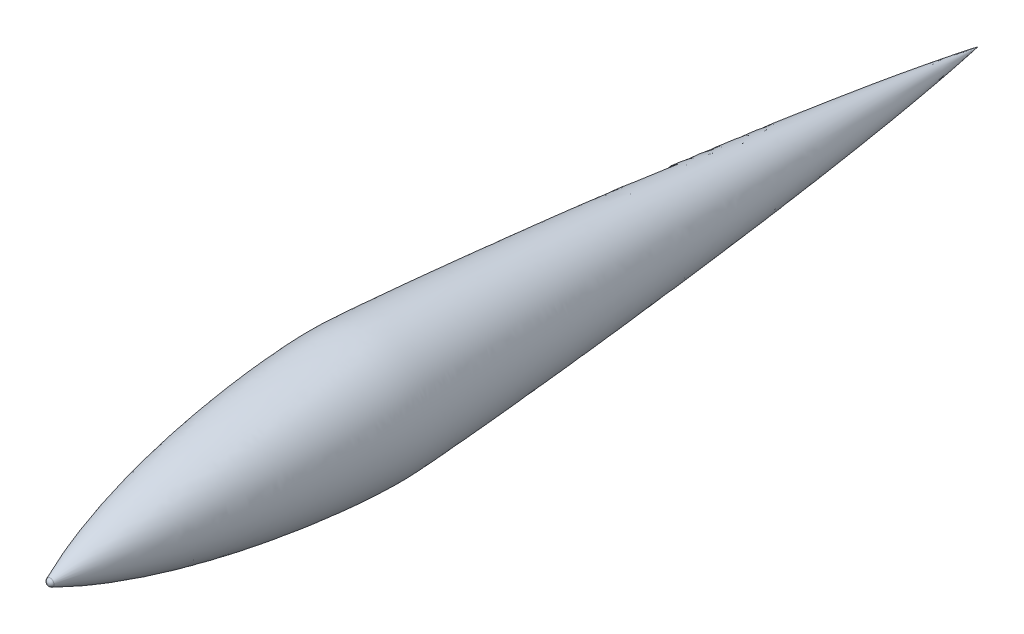
ISO-10303-21;
HEADER;
FILE_DESCRIPTION(('STEP AP214'),'2;1');
FILE_NAME('part.step','',(''),(''),'','','');
FILE_SCHEMA(('AUTOMOTIVE_DESIGN { 1 0 10303 214 1 1 1 1 }'));
ENDSEC;
DATA;
#1=APPLICATION_CONTEXT('core data for automotive mechanical design processes');
#2=APPLICATION_PROTOCOL_DEFINITION('international standard','automotive_design',2000,#1);
#3=PRODUCT_CONTEXT('',#1,'mechanical');
#4=PRODUCT('Part','Part','',(#3));
#5=PRODUCT_RELATED_PRODUCT_CATEGORY('part','',(#4));
#6=PRODUCT_DEFINITION_FORMATION('','',#4);
#7=PRODUCT_DEFINITION_CONTEXT('part definition',#1,'design');
#8=PRODUCT_DEFINITION('design','',#6,#7);
#9=PRODUCT_DEFINITION_SHAPE('','',#8);
#10=(LENGTH_UNIT() NAMED_UNIT(*) SI_UNIT(.MILLI.,.METRE.));
#11=(NAMED_UNIT(*) PLANE_ANGLE_UNIT() SI_UNIT($,.RADIAN.));
#12=(NAMED_UNIT(*) SI_UNIT($,.STERADIAN.) SOLID_ANGLE_UNIT());
#13=UNCERTAINTY_MEASURE_WITH_UNIT(LENGTH_MEASURE(1.E-05),#10,'distance_accuracy_value','');
#14=(GEOMETRIC_REPRESENTATION_CONTEXT(3) GLOBAL_UNCERTAINTY_ASSIGNED_CONTEXT((#13)) GLOBAL_UNIT_ASSIGNED_CONTEXT((#10,
#11,#12)) REPRESENTATION_CONTEXT('',''));
#15=CARTESIAN_POINT('',(0.,0.,0.));
#16=DIRECTION('',(0.,0.,1.));
#17=DIRECTION('',(1.,0.,0.));
#18=AXIS2_PLACEMENT_3D('',#15,#16,#17);
#19=CARTESIAN_POINT('',(0.,0.,75.));
#20=CARTESIAN_POINT('',(0.,10.7767656743876,51.8891514305655));
#21=CARTESIAN_POINT('',(0.,15.435250588179,8.71087732339792));
#22=CARTESIAN_POINT('',(0.,14.3466712500133,-20.0191070501374));
#23=CARTESIAN_POINT('',(0.,6.77227892901027,-111.592497632525));
#24=CARTESIAN_POINT('',(0.,0.,-150.000000000001));
#25=B_SPLINE_CURVE_WITH_KNOTS('',3,(#19,#20,#21,#22,#23,#24),.UNSPECIFIED.,.F.,.F.,(4,1,1,4),
(0.,0.313878319433384,0.413878319433384,1.),.UNSPECIFIED.);
#26=CARTESIAN_POINT('',(0.,0.,0.));
#27=DIRECTION('',(0.,0.,1.));
#28=AXIS1_PLACEMENT('',#26,#27);
#29=SURFACE_OF_REVOLUTION('',#25,#28);
#30=CARTESIAN_POINT('',(0.,0.,-150.));
#31=VERTEX_POINT('',#30);
#32=VERTEX_LOOP('',#31);
#33=FACE_BOUND('',#32,.T.);
#34=CARTESIAN_POINT('',(0.,0.,72.9737037721096));
#35=DIRECTION('',(0.,0.,1.));
#36=DIRECTION('',(1.,0.,0.));
#37=AXIS2_PLACEMENT_3D('',#34,#35,#36);
#38=CIRCLE('',#37,0.915909629578244);
#39=CARTESIAN_POINT('',(0.915909629578244,0.,72.9737037721096));
#40=VERTEX_POINT('',#39);
#41=EDGE_CURVE('E11',#40,#40,#38,.T.);
#42=ORIENTED_EDGE('',*,*,#41,.F.);
#43=EDGE_LOOP('',(#42));
#44=FACE_BOUND('',#43,.T.);
#45=ADVANCED_FACE('F41',(#33,#44),#29,.F.);
#46=CARTESIAN_POINT('',(0.,-4.23489368572838E-13,72.5723192302485));
#47=DIRECTION('',(0.,0.,1.));
#48=DIRECTION('',(0.,1.,0.));
#49=AXIS2_PLACEMENT_3D('',#46,#47,#48);
#50=SPHERICAL_SURFACE('',#49,1.);
#51=ORIENTED_EDGE('',*,*,#41,.T.);
#52=EDGE_LOOP('',(#51));
#53=FACE_BOUND('',#52,.T.);
#54=ADVANCED_FACE('F51',(#53),#50,.T.);
#55=CLOSED_SHELL('',(#45,#54));
#56=MANIFOLD_SOLID_BREP('B2',#55);
#57=ADVANCED_BREP_SHAPE_REPRESENTATION('',(#18,#56),#14);
#58=SHAPE_DEFINITION_REPRESENTATION(#9,#57);
ENDSEC;
END-ISO-10303-21;
